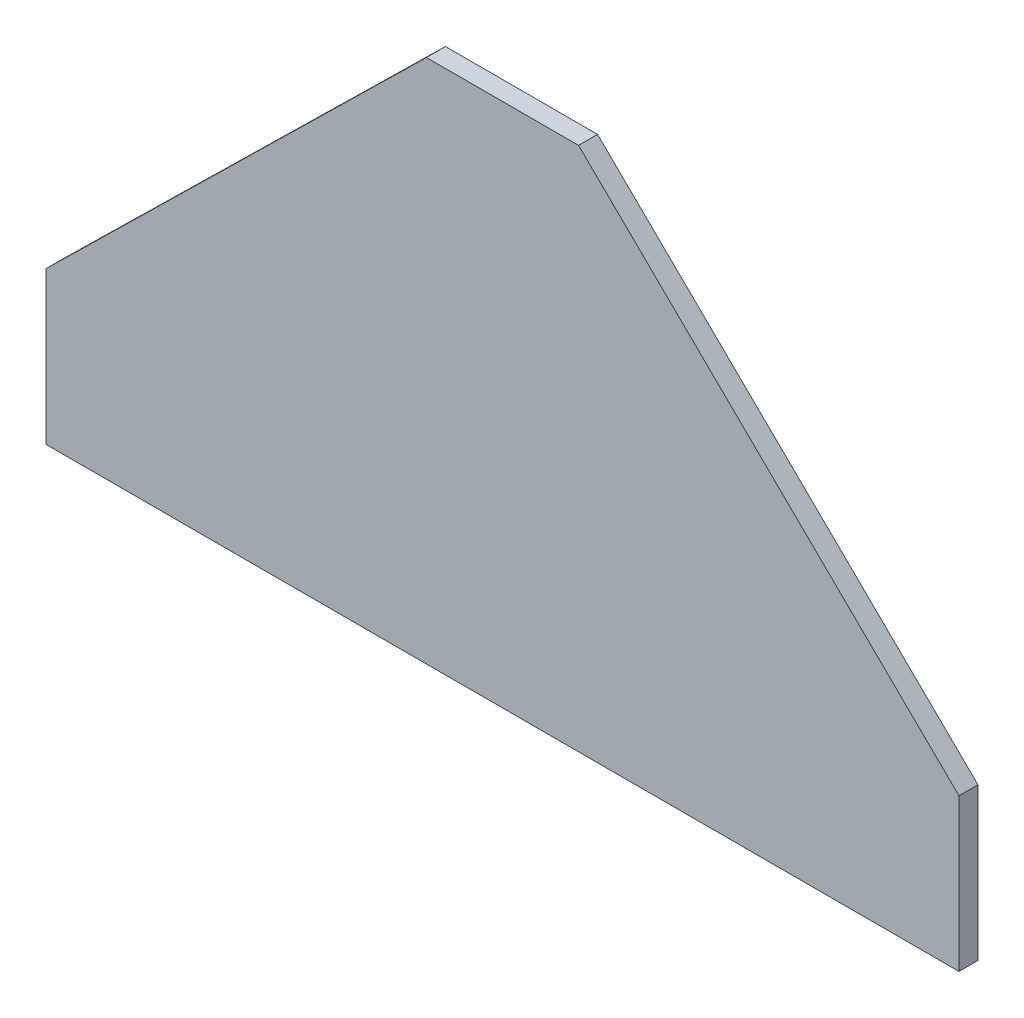
ISO-10303-21;
HEADER;
FILE_DESCRIPTION(('STEP AP214'),'2;1');
FILE_NAME('part.step','',(''),(''),'','','');
FILE_SCHEMA(('AUTOMOTIVE_DESIGN { 1 0 10303 214 1 1 1 1 }'));
ENDSEC;
DATA;
#1=APPLICATION_CONTEXT('core data for automotive mechanical design processes');
#2=APPLICATION_PROTOCOL_DEFINITION('international standard','automotive_design',2000,#1);
#3=PRODUCT_CONTEXT('',#1,'mechanical');
#4=PRODUCT('Part','Part','',(#3));
#5=PRODUCT_RELATED_PRODUCT_CATEGORY('part','',(#4));
#6=PRODUCT_DEFINITION_FORMATION('','',#4);
#7=PRODUCT_DEFINITION_CONTEXT('part definition',#1,'design');
#8=PRODUCT_DEFINITION('design','',#6,#7);
#9=PRODUCT_DEFINITION_SHAPE('','',#8);
#10=(LENGTH_UNIT() NAMED_UNIT(*) SI_UNIT(.MILLI.,.METRE.));
#11=(NAMED_UNIT(*) PLANE_ANGLE_UNIT() SI_UNIT($,.RADIAN.));
#12=(NAMED_UNIT(*) SI_UNIT($,.STERADIAN.) SOLID_ANGLE_UNIT());
#13=UNCERTAINTY_MEASURE_WITH_UNIT(LENGTH_MEASURE(1.E-05),#10,'distance_accuracy_value','');
#14=(GEOMETRIC_REPRESENTATION_CONTEXT(3) GLOBAL_UNCERTAINTY_ASSIGNED_CONTEXT((#13)) GLOBAL_UNIT_ASSIGNED_CONTEXT((#10,
#11,#12)) REPRESENTATION_CONTEXT('',''));
#15=CARTESIAN_POINT('',(0.,0.,0.));
#16=DIRECTION('',(0.,0.,1.));
#17=DIRECTION('',(1.,0.,0.));
#18=AXIS2_PLACEMENT_3D('',#15,#16,#17);
#19=CARTESIAN_POINT('',(-41.6398906187679,-27.9764893638093,6.35));
#20=DIRECTION('',(0.700167189199311,-0.713978926277755,0.));
#21=DIRECTION('',(0.713978926277755,0.700167189199311,0.));
#22=AXIS2_PLACEMENT_3D('',#19,#20,#21);
#23=PLANE('',#22);
#24=DIRECTION('',(-0.713978926277755,-0.700167189199311,0.));
#25=VECTOR('',#24,1.);
#26=CARTESIAN_POINT('',(-41.6398906187679,-27.9764893638093,0.));
#27=LINE('',#26,#25);
#28=CARTESIAN_POINT('',(85.3601093812322,96.5667285878644,0.));
#29=VERTEX_POINT('',#28);
#30=CARTESIAN_POINT('',(-41.6398906187679,-27.9764893638093,0.));
#31=VERTEX_POINT('',#30);
#32=EDGE_CURVE('E117',#29,#31,#27,.T.);
#33=ORIENTED_EDGE('',*,*,#32,.T.);
#34=DIRECTION('',(0.,0.,-1.));
#35=VECTOR('',#34,1.);
#36=CARTESIAN_POINT('',(-41.6398906187679,-27.9764893638093,6.35));
#37=LINE('',#36,#35);
#38=CARTESIAN_POINT('',(-41.6398906187679,-27.9764893638093,6.35));
#39=VERTEX_POINT('',#38);
#40=EDGE_CURVE('E11',#39,#31,#37,.T.);
#41=ORIENTED_EDGE('',*,*,#40,.F.);
#42=DIRECTION('',(-0.713978926277755,-0.700167189199311,0.));
#43=VECTOR('',#42,1.);
#44=CARTESIAN_POINT('',(-41.6398906187679,-27.9764893638093,6.35));
#45=LINE('',#44,#43);
#46=CARTESIAN_POINT('',(85.3601093812322,96.5667285878644,6.35));
#47=VERTEX_POINT('',#46);
#48=EDGE_CURVE('E127',#47,#39,#45,.T.);
#49=ORIENTED_EDGE('',*,*,#48,.F.);
#50=DIRECTION('',(0.,0.,-1.));
#51=VECTOR('',#50,1.);
#52=CARTESIAN_POINT('',(85.3601093812322,96.5667285878644,6.35));
#53=LINE('',#52,#51);
#54=EDGE_CURVE('E113',#47,#29,#53,.T.);
#55=ORIENTED_EDGE('',*,*,#54,.T.);
#56=EDGE_LOOP('',(#33,#41,#49,#55));
#57=FACE_BOUND('',#56,.T.);
#58=ADVANCED_FACE('F33',(#57),#23,.F.);
#59=CARTESIAN_POINT('',(-41.6398906187679,-78.7764893638093,6.35));
#60=DIRECTION('',(1.,0.,0.));
#61=DIRECTION('',(0.,0.,-1.));
#62=AXIS2_PLACEMENT_3D('',#59,#60,#61);
#63=PLANE('',#62);
#64=DIRECTION('',(0.,-1.,0.));
#65=VECTOR('',#64,1.);
#66=CARTESIAN_POINT('',(-41.6398906187679,-78.7764893638093,0.));
#67=LINE('',#66,#65);
#68=CARTESIAN_POINT('',(-41.6398906187679,-78.7764893638093,0.));
#69=VERTEX_POINT('',#68);
#70=EDGE_CURVE('E120',#31,#69,#67,.T.);
#71=ORIENTED_EDGE('',*,*,#70,.T.);
#72=DIRECTION('',(0.,0.,-1.));
#73=VECTOR('',#72,1.);
#74=CARTESIAN_POINT('',(-41.6398906187679,-78.7764893638093,6.35));
#75=LINE('',#74,#73);
#76=CARTESIAN_POINT('',(-41.6398906187679,-78.7764893638093,6.35));
#77=VERTEX_POINT('',#76);
#78=EDGE_CURVE('E41',#77,#69,#75,.T.);
#79=ORIENTED_EDGE('',*,*,#78,.F.);
#80=DIRECTION('',(0.,-1.,0.));
#81=VECTOR('',#80,1.);
#82=CARTESIAN_POINT('',(-41.6398906187679,-78.7764893638093,6.35));
#83=LINE('',#82,#81);
#84=EDGE_CURVE('E86',#39,#77,#83,.T.);
#85=ORIENTED_EDGE('',*,*,#84,.F.);
#86=ORIENTED_EDGE('',*,*,#40,.T.);
#87=EDGE_LOOP('',(#71,#79,#85,#86));
#88=FACE_BOUND('',#87,.T.);
#89=ADVANCED_FACE('F151',(#88),#63,.F.);
#90=CARTESIAN_POINT('',(263.160109381232,-78.7764893638093,6.35));
#91=DIRECTION('',(0.,1.,0.));
#92=DIRECTION('',(0.,0.,1.));
#93=AXIS2_PLACEMENT_3D('',#90,#91,#92);
#94=PLANE('',#93);
#95=DIRECTION('',(1.,0.,0.));
#96=VECTOR('',#95,1.);
#97=CARTESIAN_POINT('',(263.160109381232,-78.7764893638093,0.));
#98=LINE('',#97,#96);
#99=CARTESIAN_POINT('',(263.160109381232,-78.7764893638093,0.));
#100=VERTEX_POINT('',#99);
#101=EDGE_CURVE('E122',#69,#100,#98,.T.);
#102=ORIENTED_EDGE('',*,*,#101,.T.);
#103=DIRECTION('',(0.,0.,-1.));
#104=VECTOR('',#103,1.);
#105=CARTESIAN_POINT('',(263.160109381232,-78.7764893638093,6.35));
#106=LINE('',#105,#104);
#107=CARTESIAN_POINT('',(263.160109381232,-78.7764893638093,6.35));
#108=VERTEX_POINT('',#107);
#109=EDGE_CURVE('E108',#108,#100,#106,.T.);
#110=ORIENTED_EDGE('',*,*,#109,.F.);
#111=DIRECTION('',(1.,0.,0.));
#112=VECTOR('',#111,1.);
#113=CARTESIAN_POINT('',(263.160109381232,-78.7764893638093,6.35));
#114=LINE('',#113,#112);
#115=EDGE_CURVE('E99',#77,#108,#114,.T.);
#116=ORIENTED_EDGE('',*,*,#115,.F.);
#117=ORIENTED_EDGE('',*,*,#78,.T.);
#118=EDGE_LOOP('',(#102,#110,#116,#117));
#119=FACE_BOUND('',#118,.T.);
#120=ADVANCED_FACE('F133',(#119),#94,.F.);
#121=CARTESIAN_POINT('',(263.160109381232,-27.9764893638093,6.35));
#122=DIRECTION('',(-1.,0.,0.));
#123=DIRECTION('',(0.,0.,1.));
#124=AXIS2_PLACEMENT_3D('',#121,#122,#123);
#125=PLANE('',#124);
#126=DIRECTION('',(0.,1.,0.));
#127=VECTOR('',#126,1.);
#128=CARTESIAN_POINT('',(263.160109381232,-27.9764893638093,0.));
#129=LINE('',#128,#127);
#130=CARTESIAN_POINT('',(263.160109381232,-27.9764893638093,0.));
#131=VERTEX_POINT('',#130);
#132=EDGE_CURVE('E107',#100,#131,#129,.T.);
#133=ORIENTED_EDGE('',*,*,#132,.T.);
#134=DIRECTION('',(0.,0.,-1.));
#135=VECTOR('',#134,1.);
#136=CARTESIAN_POINT('',(263.160109381232,-27.9764893638093,6.35));
#137=LINE('',#136,#135);
#138=CARTESIAN_POINT('',(263.160109381232,-27.9764893638093,6.35));
#139=VERTEX_POINT('',#138);
#140=EDGE_CURVE('E104',#139,#131,#137,.T.);
#141=ORIENTED_EDGE('',*,*,#140,.F.);
#142=DIRECTION('',(0.,1.,0.));
#143=VECTOR('',#142,1.);
#144=CARTESIAN_POINT('',(263.160109381232,-27.9764893638093,6.35));
#145=LINE('',#144,#143);
#146=EDGE_CURVE('E93',#108,#139,#145,.T.);
#147=ORIENTED_EDGE('',*,*,#146,.F.);
#148=ORIENTED_EDGE('',*,*,#109,.T.);
#149=EDGE_LOOP('',(#133,#141,#147,#148));
#150=FACE_BOUND('',#149,.T.);
#151=ADVANCED_FACE('F105',(#150),#125,.F.);
#152=CARTESIAN_POINT('',(136.160109381232,96.5667285878644,6.35));
#153=DIRECTION('',(-0.700167189199311,-0.713978926277755,0.));
#154=DIRECTION('',(0.713978926277755,-0.700167189199311,0.));
#155=AXIS2_PLACEMENT_3D('',#152,#153,#154);
#156=PLANE('',#155);
#157=DIRECTION('',(-0.713978926277755,0.700167189199311,0.));
#158=VECTOR('',#157,1.);
#159=CARTESIAN_POINT('',(136.160109381232,96.5667285878644,0.));
#160=LINE('',#159,#158);
#161=CARTESIAN_POINT('',(136.160109381232,96.5667285878644,0.));
#162=VERTEX_POINT('',#161);
#163=EDGE_CURVE('E72',#131,#162,#160,.T.);
#164=ORIENTED_EDGE('',*,*,#163,.T.);
#165=DIRECTION('',(0.,0.,-1.));
#166=VECTOR('',#165,1.);
#167=CARTESIAN_POINT('',(136.160109381232,96.5667285878644,6.35));
#168=LINE('',#167,#166);
#169=CARTESIAN_POINT('',(136.160109381232,96.5667285878644,6.35));
#170=VERTEX_POINT('',#169);
#171=EDGE_CURVE('E109',#170,#162,#168,.T.);
#172=ORIENTED_EDGE('',*,*,#171,.F.);
#173=DIRECTION('',(-0.713978926277755,0.700167189199311,0.));
#174=VECTOR('',#173,1.);
#175=CARTESIAN_POINT('',(136.160109381232,96.5667285878644,6.35));
#176=LINE('',#175,#174);
#177=EDGE_CURVE('E97',#139,#170,#176,.T.);
#178=ORIENTED_EDGE('',*,*,#177,.F.);
#179=ORIENTED_EDGE('',*,*,#140,.T.);
#180=EDGE_LOOP('',(#164,#172,#178,#179));
#181=FACE_BOUND('',#180,.T.);
#182=ADVANCED_FACE('F111',(#181),#156,.F.);
#183=CARTESIAN_POINT('',(85.3601093812322,96.5667285878644,6.35));
#184=DIRECTION('',(0.,-1.,0.));
#185=DIRECTION('',(0.,0.,-1.));
#186=AXIS2_PLACEMENT_3D('',#183,#184,#185);
#187=PLANE('',#186);
#188=DIRECTION('',(-1.,0.,0.));
#189=VECTOR('',#188,1.);
#190=CARTESIAN_POINT('',(85.3601093812322,96.5667285878644,0.));
#191=LINE('',#190,#189);
#192=EDGE_CURVE('E78',#162,#29,#191,.T.);
#193=ORIENTED_EDGE('',*,*,#192,.T.);
#194=ORIENTED_EDGE('',*,*,#54,.F.);
#195=DIRECTION('',(-1.,0.,0.));
#196=VECTOR('',#195,1.);
#197=CARTESIAN_POINT('',(85.3601093812322,96.5667285878644,6.35));
#198=LINE('',#197,#196);
#199=EDGE_CURVE('E49',#170,#47,#198,.T.);
#200=ORIENTED_EDGE('',*,*,#199,.F.);
#201=ORIENTED_EDGE('',*,*,#171,.T.);
#202=EDGE_LOOP('',(#193,#194,#200,#201));
#203=FACE_BOUND('',#202,.T.);
#204=ADVANCED_FACE('F140',(#203),#187,.F.);
#205=CARTESIAN_POINT('',(0.,0.,6.35));
#206=DIRECTION('',(0.,0.,-1.));
#207=DIRECTION('',(-1.,0.,0.));
#208=AXIS2_PLACEMENT_3D('',#205,#206,#207);
#209=PLANE('',#208);
#210=ORIENTED_EDGE('',*,*,#48,.T.);
#211=ORIENTED_EDGE('',*,*,#84,.T.);
#212=ORIENTED_EDGE('',*,*,#115,.T.);
#213=ORIENTED_EDGE('',*,*,#146,.T.);
#214=ORIENTED_EDGE('',*,*,#177,.T.);
#215=ORIENTED_EDGE('',*,*,#199,.T.);
#216=EDGE_LOOP('',(#210,#211,#212,#213,#214,#215));
#217=FACE_BOUND('',#216,.T.);
#218=ADVANCED_FACE('F95',(#217),#209,.F.);
#219=CARTESIAN_POINT('',(0.,0.,0.));
#220=DIRECTION('',(0.,0.,-1.));
#221=DIRECTION('',(-1.,0.,0.));
#222=AXIS2_PLACEMENT_3D('',#219,#220,#221);
#223=PLANE('',#222);
#224=ORIENTED_EDGE('',*,*,#32,.F.);
#225=ORIENTED_EDGE('',*,*,#192,.F.);
#226=ORIENTED_EDGE('',*,*,#163,.F.);
#227=ORIENTED_EDGE('',*,*,#132,.F.);
#228=ORIENTED_EDGE('',*,*,#101,.F.);
#229=ORIENTED_EDGE('',*,*,#70,.F.);
#230=EDGE_LOOP('',(#224,#225,#226,#227,#228,#229));
#231=FACE_BOUND('',#230,.T.);
#232=ADVANCED_FACE('F136',(#231),#223,.T.);
#233=CLOSED_SHELL('',(#58,#89,#120,#151,#182,#204,#218,#232));
#234=MANIFOLD_SOLID_BREP('B2',#233);
#235=ADVANCED_BREP_SHAPE_REPRESENTATION('',(#18,#234),#14);
#236=SHAPE_DEFINITION_REPRESENTATION(#9,#235);
ENDSEC;
END-ISO-10303-21;
